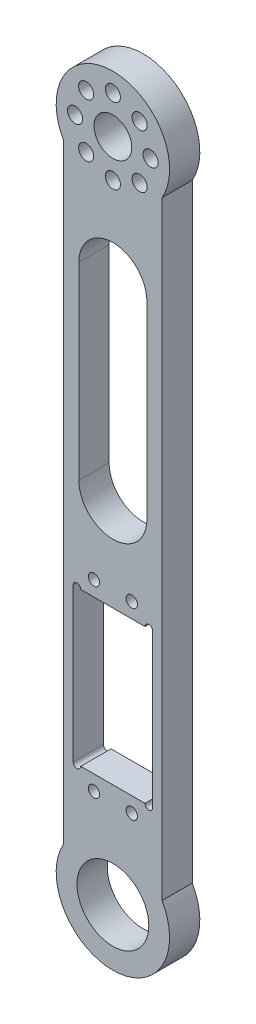
ISO-10303-21;
HEADER;
FILE_DESCRIPTION(('STEP AP214'),'2;1');
FILE_NAME('part.step','',(''),(''),'','','');
FILE_SCHEMA(('AUTOMOTIVE_DESIGN { 1 0 10303 214 1 1 1 1 }'));
ENDSEC;
DATA;
#1=APPLICATION_CONTEXT('core data for automotive mechanical design processes');
#2=APPLICATION_PROTOCOL_DEFINITION('international standard','automotive_design',2000,#1);
#3=PRODUCT_CONTEXT('',#1,'mechanical');
#4=PRODUCT('Part','Part','',(#3));
#5=PRODUCT_RELATED_PRODUCT_CATEGORY('part','',(#4));
#6=PRODUCT_DEFINITION_FORMATION('','',#4);
#7=PRODUCT_DEFINITION_CONTEXT('part definition',#1,'design');
#8=PRODUCT_DEFINITION('design','',#6,#7);
#9=PRODUCT_DEFINITION_SHAPE('','',#8);
#10=(LENGTH_UNIT() NAMED_UNIT(*) SI_UNIT(.MILLI.,.METRE.));
#11=(NAMED_UNIT(*) PLANE_ANGLE_UNIT() SI_UNIT($,.RADIAN.));
#12=(NAMED_UNIT(*) SI_UNIT($,.STERADIAN.) SOLID_ANGLE_UNIT());
#13=UNCERTAINTY_MEASURE_WITH_UNIT(LENGTH_MEASURE(1.E-05),#10,'distance_accuracy_value','');
#14=(GEOMETRIC_REPRESENTATION_CONTEXT(3) GLOBAL_UNCERTAINTY_ASSIGNED_CONTEXT((#13)) GLOBAL_UNIT_ASSIGNED_CONTEXT((#10,
#11,#12)) REPRESENTATION_CONTEXT('',''));
#15=CARTESIAN_POINT('',(0.,0.,0.));
#16=DIRECTION('',(0.,0.,1.));
#17=DIRECTION('',(1.,0.,0.));
#18=AXIS2_PLACEMENT_3D('',#15,#16,#17);
#19=CARTESIAN_POINT('',(0.,0.,8.));
#20=DIRECTION('',(0.,0.,1.));
#21=DIRECTION('',(1.,0.,0.));
#22=AXIS2_PLACEMENT_3D('',#19,#20,#21);
#23=PLANE('',#22);
#24=CARTESIAN_POINT('',(-9.5,-60.5,8.));
#25=DIRECTION('',(0.,0.,1.));
#26=DIRECTION('',(-1.,0.,0.));
#27=AXIS2_PLACEMENT_3D('',#24,#25,#26);
#28=CIRCLE('',#27,1.);
#29=CARTESIAN_POINT('',(-10.5,-60.5,8.));
#30=VERTEX_POINT('',#29);
#31=CARTESIAN_POINT('',(-8.5,-60.5,8.));
#32=VERTEX_POINT('',#31);
#33=EDGE_CURVE('E175',#30,#32,#28,.T.);
#34=ORIENTED_EDGE('',*,*,#33,.F.);
#35=DIRECTION('',(0.,-1.,0.));
#36=VECTOR('',#35,1.);
#37=CARTESIAN_POINT('',(-10.5,-20.,8.));
#38=LINE('',#37,#36);
#39=CARTESIAN_POINT('',(-10.5,-20.,8.));
#40=VERTEX_POINT('',#39);
#41=EDGE_CURVE('E220',#40,#30,#38,.T.);
#42=ORIENTED_EDGE('',*,*,#41,.F.);
#43=CARTESIAN_POINT('',(-9.50000000000001,-20.,8.));
#44=DIRECTION('',(0.,0.,1.));
#45=DIRECTION('',(1.,0.,0.));
#46=AXIS2_PLACEMENT_3D('',#43,#44,#45);
#47=CIRCLE('',#46,1.);
#48=CARTESIAN_POINT('',(-8.50000000000001,-20.,8.));
#49=VERTEX_POINT('',#48);
#50=EDGE_CURVE('E180',#49,#40,#47,.T.);
#51=ORIENTED_EDGE('',*,*,#50,.F.);
#52=DIRECTION('',(-1.,0.,0.));
#53=VECTOR('',#52,1.);
#54=CARTESIAN_POINT('',(-10.5,-20.,8.));
#55=LINE('',#54,#53);
#56=CARTESIAN_POINT('',(8.50000000000001,-20.,8.));
#57=VERTEX_POINT('',#56);
#58=EDGE_CURVE('E216',#57,#49,#55,.T.);
#59=ORIENTED_EDGE('',*,*,#58,.F.);
#60=CARTESIAN_POINT('',(9.50000000000001,-20.,8.));
#61=DIRECTION('',(0.,0.,1.));
#62=DIRECTION('',(-1.,0.,0.));
#63=AXIS2_PLACEMENT_3D('',#60,#61,#62);
#64=CIRCLE('',#63,1.);
#65=CARTESIAN_POINT('',(10.5,-20.,8.));
#66=VERTEX_POINT('',#65);
#67=EDGE_CURVE('E178',#66,#57,#64,.T.);
#68=ORIENTED_EDGE('',*,*,#67,.F.);
#69=DIRECTION('',(0.,1.,0.));
#70=VECTOR('',#69,1.);
#71=CARTESIAN_POINT('',(10.5,-20.,8.));
#72=LINE('',#71,#70);
#73=CARTESIAN_POINT('',(10.5,-60.5,8.));
#74=VERTEX_POINT('',#73);
#75=EDGE_CURVE('E213',#74,#66,#72,.T.);
#76=ORIENTED_EDGE('',*,*,#75,.F.);
#77=CARTESIAN_POINT('',(9.50000000000001,-60.5,8.));
#78=DIRECTION('',(0.,0.,1.));
#79=DIRECTION('',(1.,0.,0.));
#80=AXIS2_PLACEMENT_3D('',#77,#78,#79);
#81=CIRCLE('',#80,1.);
#82=CARTESIAN_POINT('',(8.50000000000001,-60.5,8.));
#83=VERTEX_POINT('',#82);
#84=EDGE_CURVE('E181',#83,#74,#81,.T.);
#85=ORIENTED_EDGE('',*,*,#84,.F.);
#86=DIRECTION('',(1.,0.,0.));
#87=VECTOR('',#86,1.);
#88=CARTESIAN_POINT('',(-10.5,-60.5,8.));
#89=LINE('',#88,#87);
#90=EDGE_CURVE('E223',#32,#83,#89,.T.);
#91=ORIENTED_EDGE('',*,*,#90,.F.);
#92=EDGE_LOOP('',(#34,#42,#51,#59,#68,#76,#85,#91));
#93=FACE_BOUND('',#92,.T.);
#94=CARTESIAN_POINT('',(5.00000000000031,-16.,8.));
#95=DIRECTION('',(0.,0.,1.));
#96=DIRECTION('',(1.,0.,0.));
#97=AXIS2_PLACEMENT_3D('',#94,#95,#96);
#98=CIRCLE('',#97,1.5);
#99=CARTESIAN_POINT('',(6.50000000000031,-16.,8.));
#100=VERTEX_POINT('',#99);
#101=EDGE_CURVE('E204',#100,#100,#98,.T.);
#102=ORIENTED_EDGE('',*,*,#101,.F.);
#103=EDGE_LOOP('',(#102));
#104=FACE_BOUND('',#103,.T.);
#105=CARTESIAN_POINT('',(-5.00000000000005,-64.5,8.));
#106=DIRECTION('',(0.,0.,1.));
#107=DIRECTION('',(1.,0.,0.));
#108=AXIS2_PLACEMENT_3D('',#105,#106,#107);
#109=CIRCLE('',#108,1.5);
#110=CARTESIAN_POINT('',(-3.50000000000005,-64.5,8.));
#111=VERTEX_POINT('',#110);
#112=EDGE_CURVE('E203',#111,#111,#109,.T.);
#113=ORIENTED_EDGE('',*,*,#112,.F.);
#114=EDGE_LOOP('',(#113));
#115=FACE_BOUND('',#114,.T.);
#116=CARTESIAN_POINT('',(4.99999999999997,-64.5,8.));
#117=DIRECTION('',(0.,0.,1.));
#118=DIRECTION('',(1.,0.,0.));
#119=AXIS2_PLACEMENT_3D('',#116,#117,#118);
#120=CIRCLE('',#119,1.5);
#121=CARTESIAN_POINT('',(6.49999999999997,-64.5,8.));
#122=VERTEX_POINT('',#121);
#123=EDGE_CURVE('E200',#122,#122,#120,.T.);
#124=ORIENTED_EDGE('',*,*,#123,.F.);
#125=EDGE_LOOP('',(#124));
#126=FACE_BOUND('',#125,.T.);
#127=CARTESIAN_POINT('',(-4.99999999999969,-16.,8.));
#128=DIRECTION('',(0.,0.,1.));
#129=DIRECTION('',(1.,0.,0.));
#130=AXIS2_PLACEMENT_3D('',#127,#128,#129);
#131=CIRCLE('',#130,1.5);
#132=CARTESIAN_POINT('',(-3.49999999999969,-16.,8.));
#133=VERTEX_POINT('',#132);
#134=EDGE_CURVE('E207',#133,#133,#131,.T.);
#135=ORIENTED_EDGE('',*,*,#134,.F.);
#136=EDGE_LOOP('',(#135));
#137=FACE_BOUND('',#136,.T.);
#138=CARTESIAN_POINT('',(-7.07106781186532,80.9289321881343,8.));
#139=DIRECTION('',(0.,0.,1.));
#140=DIRECTION('',(1.,0.,0.));
#141=AXIS2_PLACEMENT_3D('',#138,#139,#140);
#142=CIRCLE('',#141,2.);
#143=CARTESIAN_POINT('',(-5.07106781186532,80.9289321881343,8.));
#144=VERTEX_POINT('',#143);
#145=EDGE_CURVE('E240',#144,#144,#142,.T.);
#146=ORIENTED_EDGE('',*,*,#145,.F.);
#147=EDGE_LOOP('',(#146));
#148=FACE_BOUND('',#147,.T.);
#149=CARTESIAN_POINT('',(7.07106781186563,80.9289321881347,8.));
#150=DIRECTION('',(0.,0.,1.));
#151=DIRECTION('',(1.,0.,0.));
#152=AXIS2_PLACEMENT_3D('',#149,#150,#151);
#153=CIRCLE('',#152,2.00000000000005);
#154=CARTESIAN_POINT('',(9.07106781186569,80.9289321881347,8.));
#155=VERTEX_POINT('',#154);
#156=EDGE_CURVE('E259',#155,#155,#153,.T.);
#157=ORIENTED_EDGE('',*,*,#156,.F.);
#158=EDGE_LOOP('',(#157));
#159=FACE_BOUND('',#158,.T.);
#160=CARTESIAN_POINT('',(7.07106781186531,95.0710678118656,8.));
#161=DIRECTION('',(0.,0.,1.));
#162=DIRECTION('',(1.,0.,0.));
#163=AXIS2_PLACEMENT_3D('',#160,#161,#162);
#164=CIRCLE('',#163,1.99999999999999);
#165=CARTESIAN_POINT('',(9.0710678118653,95.0710678118656,8.));
#166=VERTEX_POINT('',#165);
#167=EDGE_CURVE('E253',#166,#166,#164,.T.);
#168=ORIENTED_EDGE('',*,*,#167,.F.);
#169=EDGE_LOOP('',(#168));
#170=FACE_BOUND('',#169,.T.);
#171=CARTESIAN_POINT('',(-10.,88.,8.));
#172=DIRECTION('',(0.,0.,1.));
#173=DIRECTION('',(1.,0.,0.));
#174=AXIS2_PLACEMENT_3D('',#171,#172,#173);
#175=CIRCLE('',#174,2.00000000000011);
#176=CARTESIAN_POINT('',(-7.99999999999989,88.,8.));
#177=VERTEX_POINT('',#176);
#178=EDGE_CURVE('E247',#177,#177,#175,.T.);
#179=ORIENTED_EDGE('',*,*,#178,.F.);
#180=EDGE_LOOP('',(#179));
#181=FACE_BOUND('',#180,.T.);
#182=CARTESIAN_POINT('',(0.,98.,8.));
#183=DIRECTION('',(0.,0.,1.));
#184=DIRECTION('',(1.,0.,0.));
#185=AXIS2_PLACEMENT_3D('',#182,#183,#184);
#186=CIRCLE('',#185,2.);
#187=CARTESIAN_POINT('',(2.,98.,8.));
#188=VERTEX_POINT('',#187);
#189=EDGE_CURVE('E283',#188,#188,#186,.T.);
#190=ORIENTED_EDGE('',*,*,#189,.F.);
#191=EDGE_LOOP('',(#190));
#192=FACE_BOUND('',#191,.T.);
#193=CARTESIAN_POINT('',(0.,-88.,8.));
#194=DIRECTION('',(0.,0.,1.));
#195=DIRECTION('',(1.,0.,0.));
#196=AXIS2_PLACEMENT_3D('',#193,#194,#195);
#197=CIRCLE('',#196,9.49999999999999);
#198=CARTESIAN_POINT('',(9.5,-88.,8.));
#199=VERTEX_POINT('',#198);
#200=EDGE_CURVE('E270',#199,#199,#197,.T.);
#201=ORIENTED_EDGE('',*,*,#200,.F.);
#202=EDGE_LOOP('',(#201));
#203=FACE_BOUND('',#202,.T.);
#204=CARTESIAN_POINT('',(9.99999999999999,88.,8.));
#205=DIRECTION('',(0.,0.,1.));
#206=DIRECTION('',(1.,0.,0.));
#207=AXIS2_PLACEMENT_3D('',#204,#205,#206);
#208=CIRCLE('',#207,1.99999999999987);
#209=CARTESIAN_POINT('',(11.9999999999999,88.,8.));
#210=VERTEX_POINT('',#209);
#211=EDGE_CURVE('E271',#210,#210,#208,.T.);
#212=ORIENTED_EDGE('',*,*,#211,.F.);
#213=EDGE_LOOP('',(#212));
#214=FACE_BOUND('',#213,.T.);
#215=CARTESIAN_POINT('',(0.,78.,8.));
#216=DIRECTION('',(0.,0.,1.));
#217=DIRECTION('',(1.,0.,0.));
#218=AXIS2_PLACEMENT_3D('',#215,#216,#217);
#219=CIRCLE('',#218,2.);
#220=CARTESIAN_POINT('',(2.,78.,8.));
#221=VERTEX_POINT('',#220);
#222=EDGE_CURVE('E246',#221,#221,#219,.T.);
#223=ORIENTED_EDGE('',*,*,#222,.F.);
#224=EDGE_LOOP('',(#223));
#225=FACE_BOUND('',#224,.T.);
#226=CARTESIAN_POINT('',(-7.07106781186564,95.0710678118653,8.));
#227=DIRECTION('',(0.,0.,1.));
#228=DIRECTION('',(1.,0.,0.));
#229=AXIS2_PLACEMENT_3D('',#226,#227,#228);
#230=CIRCLE('',#229,1.99999999999991);
#231=CARTESIAN_POINT('',(-5.07106781186573,95.0710678118653,8.));
#232=VERTEX_POINT('',#231);
#233=EDGE_CURVE('E230',#232,#232,#230,.T.);
#234=ORIENTED_EDGE('',*,*,#233,.F.);
#235=EDGE_LOOP('',(#234));
#236=FACE_BOUND('',#235,.T.);
#237=CARTESIAN_POINT('',(0.,88.,8.));
#238=DIRECTION('',(0.,0.,1.));
#239=DIRECTION('',(1.,0.,0.));
#240=AXIS2_PLACEMENT_3D('',#237,#238,#239);
#241=CIRCLE('',#240,5.00000000000001);
#242=CARTESIAN_POINT('',(5.,88.,8.));
#243=VERTEX_POINT('',#242);
#244=EDGE_CURVE('E282',#243,#243,#241,.T.);
#245=ORIENTED_EDGE('',*,*,#244,.F.);
#246=EDGE_LOOP('',(#245));
#247=FACE_BOUND('',#246,.T.);
#248=CARTESIAN_POINT('',(0.,88.,8.));
#249=DIRECTION('',(0.,0.,1.));
#250=DIRECTION('',(1.,0.,0.));
#251=AXIS2_PLACEMENT_3D('',#248,#249,#250);
#252=CIRCLE('',#251,15.);
#253=CARTESIAN_POINT('',(13.,80.5166852264521,8.));
#254=VERTEX_POINT('',#253);
#255=CARTESIAN_POINT('',(-13.,80.5166852264521,8.));
#256=VERTEX_POINT('',#255);
#257=EDGE_CURVE('E297',#254,#256,#252,.T.);
#258=ORIENTED_EDGE('',*,*,#257,.T.);
#259=DIRECTION('',(0.,-1.,0.));
#260=VECTOR('',#259,1.);
#261=CARTESIAN_POINT('',(-13.,0.,8.));
#262=LINE('',#261,#260);
#263=CARTESIAN_POINT('',(-13.,-80.5166852264521,8.));
#264=VERTEX_POINT('',#263);
#265=EDGE_CURVE('E300',#256,#264,#262,.T.);
#266=ORIENTED_EDGE('',*,*,#265,.T.);
#267=CARTESIAN_POINT('',(0.,-88.,8.));
#268=DIRECTION('',(0.,0.,1.));
#269=DIRECTION('',(1.,0.,0.));
#270=AXIS2_PLACEMENT_3D('',#267,#268,#269);
#271=CIRCLE('',#270,15.);
#272=CARTESIAN_POINT('',(13.,-80.5166852264521,8.));
#273=VERTEX_POINT('',#272);
#274=EDGE_CURVE('E303',#264,#273,#271,.T.);
#275=ORIENTED_EDGE('',*,*,#274,.T.);
#276=DIRECTION('',(0.,-1.,0.));
#277=VECTOR('',#276,1.);
#278=CARTESIAN_POINT('',(13.,0.,8.));
#279=LINE('',#278,#277);
#280=EDGE_CURVE('E305',#254,#273,#279,.T.);
#281=ORIENTED_EDGE('',*,*,#280,.F.);
#282=EDGE_LOOP('',(#258,#266,#275,#281));
#283=FACE_BOUND('',#282,.T.);
#284=DIRECTION('',(0.,-1.,0.));
#285=VECTOR('',#284,1.);
#286=CARTESIAN_POINT('',(-8.99999999999999,0.,8.));
#287=LINE('',#286,#285);
#288=CARTESIAN_POINT('',(-9.,54.75,8.));
#289=VERTEX_POINT('',#288);
#290=CARTESIAN_POINT('',(-8.99999999999999,4.75,8.));
#291=VERTEX_POINT('',#290);
#292=EDGE_CURVE('E163',#289,#291,#287,.T.);
#293=ORIENTED_EDGE('',*,*,#292,.F.);
#294=CARTESIAN_POINT('',(0.,54.75,8.));
#295=DIRECTION('',(0.,0.,1.));
#296=DIRECTION('',(1.,0.,0.));
#297=AXIS2_PLACEMENT_3D('',#294,#295,#296);
#298=CIRCLE('',#297,9.);
#299=CARTESIAN_POINT('',(9.,54.75,8.));
#300=VERTEX_POINT('',#299);
#301=EDGE_CURVE('E54',#289,#300,#298,.F.);
#302=ORIENTED_EDGE('',*,*,#301,.T.);
#303=DIRECTION('',(0.,-1.,0.));
#304=VECTOR('',#303,1.);
#305=CARTESIAN_POINT('',(9.00000000000001,0.,8.));
#306=LINE('',#305,#304);
#307=CARTESIAN_POINT('',(9.00000000000001,4.74999999999999,8.));
#308=VERTEX_POINT('',#307);
#309=EDGE_CURVE('E168',#300,#308,#306,.T.);
#310=ORIENTED_EDGE('',*,*,#309,.T.);
#311=CARTESIAN_POINT('',(0.,4.74999999999999,8.));
#312=DIRECTION('',(0.,0.,1.));
#313=DIRECTION('',(1.,0.,0.));
#314=AXIS2_PLACEMENT_3D('',#311,#312,#313);
#315=CIRCLE('',#314,9.);
#316=EDGE_CURVE('E154',#291,#308,#315,.T.);
#317=ORIENTED_EDGE('',*,*,#316,.F.);
#318=EDGE_LOOP('',(#293,#302,#310,#317));
#319=FACE_BOUND('',#318,.T.);
#320=ADVANCED_FACE('F39',(#93,#104,#115,#126,#137,#148,#159,#170,#181,#192,#203,#214,#225,#236,
#247,#283,#319),#23,.T.);
#321=CARTESIAN_POINT('',(0.,0.,0.));
#322=DIRECTION('',(0.,0.,1.));
#323=DIRECTION('',(1.,0.,0.));
#324=AXIS2_PLACEMENT_3D('',#321,#322,#323);
#325=PLANE('',#324);
#326=CARTESIAN_POINT('',(0.,88.,0.));
#327=DIRECTION('',(0.,0.,1.));
#328=DIRECTION('',(1.,0.,0.));
#329=AXIS2_PLACEMENT_3D('',#326,#327,#328);
#330=CIRCLE('',#329,15.);
#331=CARTESIAN_POINT('',(13.,80.5166852264521,0.));
#332=VERTEX_POINT('',#331);
#333=CARTESIAN_POINT('',(-13.,80.5166852264521,0.));
#334=VERTEX_POINT('',#333);
#335=EDGE_CURVE('E294',#332,#334,#330,.T.);
#336=ORIENTED_EDGE('',*,*,#335,.F.);
#337=DIRECTION('',(0.,-1.,0.));
#338=VECTOR('',#337,1.);
#339=CARTESIAN_POINT('',(13.,0.,0.));
#340=LINE('',#339,#338);
#341=CARTESIAN_POINT('',(13.,-80.5166852264521,0.));
#342=VERTEX_POINT('',#341);
#343=EDGE_CURVE('E301',#332,#342,#340,.T.);
#344=ORIENTED_EDGE('',*,*,#343,.T.);
#345=CARTESIAN_POINT('',(0.,-88.,0.));
#346=DIRECTION('',(0.,0.,1.));
#347=DIRECTION('',(1.,0.,0.));
#348=AXIS2_PLACEMENT_3D('',#345,#346,#347);
#349=CIRCLE('',#348,15.);
#350=CARTESIAN_POINT('',(-13.,-80.5166852264521,0.));
#351=VERTEX_POINT('',#350);
#352=EDGE_CURVE('E313',#351,#342,#349,.T.);
#353=ORIENTED_EDGE('',*,*,#352,.F.);
#354=DIRECTION('',(0.,-1.,0.));
#355=VECTOR('',#354,1.);
#356=CARTESIAN_POINT('',(-13.,0.,0.));
#357=LINE('',#356,#355);
#358=EDGE_CURVE('E311',#334,#351,#357,.T.);
#359=ORIENTED_EDGE('',*,*,#358,.F.);
#360=EDGE_LOOP('',(#336,#344,#353,#359));
#361=FACE_BOUND('',#360,.T.);
#362=CARTESIAN_POINT('',(0.,88.,0.));
#363=DIRECTION('',(0.,0.,1.));
#364=DIRECTION('',(1.,0.,0.));
#365=AXIS2_PLACEMENT_3D('',#362,#363,#364);
#366=CIRCLE('',#365,5.00000000000001);
#367=CARTESIAN_POINT('',(5.,88.,0.));
#368=VERTEX_POINT('',#367);
#369=EDGE_CURVE('E291',#368,#368,#366,.T.);
#370=ORIENTED_EDGE('',*,*,#369,.T.);
#371=EDGE_LOOP('',(#370));
#372=FACE_BOUND('',#371,.T.);
#373=CARTESIAN_POINT('',(-7.07106781186564,95.0710678118653,0.));
#374=DIRECTION('',(0.,0.,1.));
#375=DIRECTION('',(1.,0.,0.));
#376=AXIS2_PLACEMENT_3D('',#373,#374,#375);
#377=CIRCLE('',#376,1.99999999999991);
#378=CARTESIAN_POINT('',(-5.07106781186573,95.0710678118653,0.));
#379=VERTEX_POINT('',#378);
#380=EDGE_CURVE('E237',#379,#379,#377,.T.);
#381=ORIENTED_EDGE('',*,*,#380,.T.);
#382=EDGE_LOOP('',(#381));
#383=FACE_BOUND('',#382,.T.);
#384=CARTESIAN_POINT('',(0.,78.,0.));
#385=DIRECTION('',(0.,0.,1.));
#386=DIRECTION('',(1.,0.,0.));
#387=AXIS2_PLACEMENT_3D('',#384,#385,#386);
#388=CIRCLE('',#387,2.);
#389=CARTESIAN_POINT('',(2.,78.,0.));
#390=VERTEX_POINT('',#389);
#391=EDGE_CURVE('E274',#390,#390,#388,.T.);
#392=ORIENTED_EDGE('',*,*,#391,.T.);
#393=EDGE_LOOP('',(#392));
#394=FACE_BOUND('',#393,.T.);
#395=CARTESIAN_POINT('',(9.99999999999999,88.,0.));
#396=DIRECTION('',(0.,0.,1.));
#397=DIRECTION('',(1.,0.,0.));
#398=AXIS2_PLACEMENT_3D('',#395,#396,#397);
#399=CIRCLE('',#398,1.99999999999987);
#400=CARTESIAN_POINT('',(11.9999999999999,88.,0.));
#401=VERTEX_POINT('',#400);
#402=EDGE_CURVE('E267',#401,#401,#399,.T.);
#403=ORIENTED_EDGE('',*,*,#402,.T.);
#404=EDGE_LOOP('',(#403));
#405=FACE_BOUND('',#404,.T.);
#406=CARTESIAN_POINT('',(0.,-88.,0.));
#407=DIRECTION('',(0.,0.,1.));
#408=DIRECTION('',(1.,0.,0.));
#409=AXIS2_PLACEMENT_3D('',#406,#407,#408);
#410=CIRCLE('',#409,9.49999999999999);
#411=CARTESIAN_POINT('',(9.5,-88.,0.));
#412=VERTEX_POINT('',#411);
#413=EDGE_CURVE('E286',#412,#412,#410,.T.);
#414=ORIENTED_EDGE('',*,*,#413,.T.);
#415=EDGE_LOOP('',(#414));
#416=FACE_BOUND('',#415,.T.);
#417=CARTESIAN_POINT('',(0.,98.,0.));
#418=DIRECTION('',(0.,0.,1.));
#419=DIRECTION('',(1.,0.,0.));
#420=AXIS2_PLACEMENT_3D('',#417,#418,#419);
#421=CIRCLE('',#420,2.);
#422=CARTESIAN_POINT('',(2.,98.,0.));
#423=VERTEX_POINT('',#422);
#424=EDGE_CURVE('E279',#423,#423,#421,.T.);
#425=ORIENTED_EDGE('',*,*,#424,.T.);
#426=EDGE_LOOP('',(#425));
#427=FACE_BOUND('',#426,.T.);
#428=CARTESIAN_POINT('',(-10.,88.,0.));
#429=DIRECTION('',(0.,0.,1.));
#430=DIRECTION('',(1.,0.,0.));
#431=AXIS2_PLACEMENT_3D('',#428,#429,#430);
#432=CIRCLE('',#431,2.00000000000011);
#433=CARTESIAN_POINT('',(-7.99999999999989,88.,0.));
#434=VERTEX_POINT('',#433);
#435=EDGE_CURVE('E243',#434,#434,#432,.T.);
#436=ORIENTED_EDGE('',*,*,#435,.T.);
#437=EDGE_LOOP('',(#436));
#438=FACE_BOUND('',#437,.T.);
#439=CARTESIAN_POINT('',(7.07106781186531,95.0710678118656,0.));
#440=DIRECTION('',(0.,0.,1.));
#441=DIRECTION('',(1.,0.,0.));
#442=AXIS2_PLACEMENT_3D('',#439,#440,#441);
#443=CIRCLE('',#442,1.99999999999999);
#444=CARTESIAN_POINT('',(9.0710678118653,95.0710678118656,0.));
#445=VERTEX_POINT('',#444);
#446=EDGE_CURVE('E250',#445,#445,#443,.T.);
#447=ORIENTED_EDGE('',*,*,#446,.T.);
#448=EDGE_LOOP('',(#447));
#449=FACE_BOUND('',#448,.T.);
#450=CARTESIAN_POINT('',(7.07106781186563,80.9289321881347,0.));
#451=DIRECTION('',(0.,0.,1.));
#452=DIRECTION('',(1.,0.,0.));
#453=AXIS2_PLACEMENT_3D('',#450,#451,#452);
#454=CIRCLE('',#453,2.00000000000005);
#455=CARTESIAN_POINT('',(9.07106781186569,80.9289321881347,0.));
#456=VERTEX_POINT('',#455);
#457=EDGE_CURVE('E256',#456,#456,#454,.T.);
#458=ORIENTED_EDGE('',*,*,#457,.T.);
#459=EDGE_LOOP('',(#458));
#460=FACE_BOUND('',#459,.T.);
#461=CARTESIAN_POINT('',(-7.07106781186532,80.9289321881343,0.));
#462=DIRECTION('',(0.,0.,1.));
#463=DIRECTION('',(1.,0.,0.));
#464=AXIS2_PLACEMENT_3D('',#461,#462,#463);
#465=CIRCLE('',#464,2.);
#466=CARTESIAN_POINT('',(-5.07106781186532,80.9289321881343,0.));
#467=VERTEX_POINT('',#466);
#468=EDGE_CURVE('E262',#467,#467,#465,.T.);
#469=ORIENTED_EDGE('',*,*,#468,.T.);
#470=EDGE_LOOP('',(#469));
#471=FACE_BOUND('',#470,.T.);
#472=DIRECTION('',(0.,-1.,0.));
#473=VECTOR('',#472,1.);
#474=CARTESIAN_POINT('',(-10.5,0.,0.));
#475=LINE('',#474,#473);
#476=CARTESIAN_POINT('',(-10.5,-20.,0.));
#477=VERTEX_POINT('',#476);
#478=CARTESIAN_POINT('',(-10.5,-60.5,0.));
#479=VERTEX_POINT('',#478);
#480=EDGE_CURVE('E330',#477,#479,#475,.T.);
#481=ORIENTED_EDGE('',*,*,#480,.T.);
#482=CARTESIAN_POINT('',(-9.5,-60.5,0.));
#483=DIRECTION('',(0.,0.,1.));
#484=DIRECTION('',(1.,0.,0.));
#485=AXIS2_PLACEMENT_3D('',#482,#483,#484);
#486=CIRCLE('',#485,1.);
#487=CARTESIAN_POINT('',(-8.5,-60.5,0.));
#488=VERTEX_POINT('',#487);
#489=EDGE_CURVE('E191',#479,#488,#486,.T.);
#490=ORIENTED_EDGE('',*,*,#489,.T.);
#491=DIRECTION('',(1.,0.,0.));
#492=VECTOR('',#491,1.);
#493=CARTESIAN_POINT('',(0.,-60.5,0.));
#494=LINE('',#493,#492);
#495=CARTESIAN_POINT('',(8.50000000000001,-60.5,0.));
#496=VERTEX_POINT('',#495);
#497=EDGE_CURVE('E333',#488,#496,#494,.T.);
#498=ORIENTED_EDGE('',*,*,#497,.T.);
#499=CARTESIAN_POINT('',(9.50000000000001,-60.5,0.));
#500=DIRECTION('',(0.,0.,1.));
#501=DIRECTION('',(1.,0.,0.));
#502=AXIS2_PLACEMENT_3D('',#499,#500,#501);
#503=CIRCLE('',#502,1.);
#504=CARTESIAN_POINT('',(10.5,-60.5,0.));
#505=VERTEX_POINT('',#504);
#506=EDGE_CURVE('E197',#496,#505,#503,.T.);
#507=ORIENTED_EDGE('',*,*,#506,.T.);
#508=DIRECTION('',(0.,1.,0.));
#509=VECTOR('',#508,1.);
#510=CARTESIAN_POINT('',(10.5,0.,0.));
#511=LINE('',#510,#509);
#512=CARTESIAN_POINT('',(10.5,-20.,0.));
#513=VERTEX_POINT('',#512);
#514=EDGE_CURVE('E336',#505,#513,#511,.T.);
#515=ORIENTED_EDGE('',*,*,#514,.T.);
#516=CARTESIAN_POINT('',(9.50000000000001,-20.,0.));
#517=DIRECTION('',(0.,0.,1.));
#518=DIRECTION('',(1.,0.,0.));
#519=AXIS2_PLACEMENT_3D('',#516,#517,#518);
#520=CIRCLE('',#519,1.);
#521=CARTESIAN_POINT('',(8.50000000000001,-20.,0.));
#522=VERTEX_POINT('',#521);
#523=EDGE_CURVE('E188',#513,#522,#520,.T.);
#524=ORIENTED_EDGE('',*,*,#523,.T.);
#525=DIRECTION('',(-1.,0.,0.));
#526=VECTOR('',#525,1.);
#527=CARTESIAN_POINT('',(0.,-20.,0.));
#528=LINE('',#527,#526);
#529=CARTESIAN_POINT('',(-8.50000000000001,-20.,0.));
#530=VERTEX_POINT('',#529);
#531=EDGE_CURVE('E327',#522,#530,#528,.T.);
#532=ORIENTED_EDGE('',*,*,#531,.T.);
#533=CARTESIAN_POINT('',(-9.50000000000001,-20.,0.));
#534=DIRECTION('',(0.,0.,1.));
#535=DIRECTION('',(1.,0.,0.));
#536=AXIS2_PLACEMENT_3D('',#533,#534,#535);
#537=CIRCLE('',#536,1.);
#538=EDGE_CURVE('E185',#530,#477,#537,.T.);
#539=ORIENTED_EDGE('',*,*,#538,.T.);
#540=EDGE_LOOP('',(#481,#490,#498,#507,#515,#524,#532,#539));
#541=FACE_BOUND('',#540,.T.);
#542=CARTESIAN_POINT('',(-4.99999999999969,-16.,0.));
#543=DIRECTION('',(0.,0.,1.));
#544=DIRECTION('',(1.,0.,0.));
#545=AXIS2_PLACEMENT_3D('',#542,#543,#544);
#546=CIRCLE('',#545,1.5);
#547=CARTESIAN_POINT('',(-3.49999999999969,-16.,0.));
#548=VERTEX_POINT('',#547);
#549=EDGE_CURVE('E212',#548,#548,#546,.T.);
#550=ORIENTED_EDGE('',*,*,#549,.T.);
#551=EDGE_LOOP('',(#550));
#552=FACE_BOUND('',#551,.T.);
#553=CARTESIAN_POINT('',(4.99999999999997,-64.5,0.));
#554=DIRECTION('',(0.,0.,1.));
#555=DIRECTION('',(1.,0.,0.));
#556=AXIS2_PLACEMENT_3D('',#553,#554,#555);
#557=CIRCLE('',#556,1.5);
#558=CARTESIAN_POINT('',(6.49999999999997,-64.5,0.));
#559=VERTEX_POINT('',#558);
#560=EDGE_CURVE('E342',#559,#559,#557,.T.);
#561=ORIENTED_EDGE('',*,*,#560,.T.);
#562=EDGE_LOOP('',(#561));
#563=FACE_BOUND('',#562,.T.);
#564=CARTESIAN_POINT('',(-5.00000000000005,-64.5,0.));
#565=DIRECTION('',(0.,0.,1.));
#566=DIRECTION('',(1.,0.,0.));
#567=AXIS2_PLACEMENT_3D('',#564,#565,#566);
#568=CIRCLE('',#567,1.5);
#569=CARTESIAN_POINT('',(-3.50000000000005,-64.5,0.));
#570=VERTEX_POINT('',#569);
#571=EDGE_CURVE('E345',#570,#570,#568,.T.);
#572=ORIENTED_EDGE('',*,*,#571,.T.);
#573=EDGE_LOOP('',(#572));
#574=FACE_BOUND('',#573,.T.);
#575=CARTESIAN_POINT('',(5.00000000000031,-16.,0.));
#576=DIRECTION('',(0.,0.,1.));
#577=DIRECTION('',(1.,0.,0.));
#578=AXIS2_PLACEMENT_3D('',#575,#576,#577);
#579=CIRCLE('',#578,1.5);
#580=CARTESIAN_POINT('',(6.50000000000031,-16.,0.));
#581=VERTEX_POINT('',#580);
#582=EDGE_CURVE('E217',#581,#581,#579,.T.);
#583=ORIENTED_EDGE('',*,*,#582,.T.);
#584=EDGE_LOOP('',(#583));
#585=FACE_BOUND('',#584,.T.);
#586=CARTESIAN_POINT('',(0.,54.75,0.));
#587=DIRECTION('',(0.,0.,1.));
#588=DIRECTION('',(1.,0.,0.));
#589=AXIS2_PLACEMENT_3D('',#586,#587,#588);
#590=CIRCLE('',#589,9.);
#591=CARTESIAN_POINT('',(-9.,54.75,0.));
#592=VERTEX_POINT('',#591);
#593=CARTESIAN_POINT('',(9.,54.75,0.));
#594=VERTEX_POINT('',#593);
#595=EDGE_CURVE('E11',#592,#594,#590,.F.);
#596=ORIENTED_EDGE('',*,*,#595,.F.);
#597=DIRECTION('',(0.,-1.,0.));
#598=VECTOR('',#597,1.);
#599=CARTESIAN_POINT('',(-8.99999999999999,0.,0.));
#600=LINE('',#599,#598);
#601=CARTESIAN_POINT('',(-8.99999999999999,4.75,0.));
#602=VERTEX_POINT('',#601);
#603=EDGE_CURVE('E358',#592,#602,#600,.T.);
#604=ORIENTED_EDGE('',*,*,#603,.T.);
#605=CARTESIAN_POINT('',(0.,4.74999999999999,0.));
#606=DIRECTION('',(0.,0.,1.));
#607=DIRECTION('',(1.,0.,0.));
#608=AXIS2_PLACEMENT_3D('',#605,#606,#607);
#609=CIRCLE('',#608,9.);
#610=CARTESIAN_POINT('',(9.00000000000001,4.74999999999999,0.));
#611=VERTEX_POINT('',#610);
#612=EDGE_CURVE('E157',#602,#611,#609,.T.);
#613=ORIENTED_EDGE('',*,*,#612,.T.);
#614=DIRECTION('',(0.,-1.,0.));
#615=VECTOR('',#614,1.);
#616=CARTESIAN_POINT('',(9.00000000000001,0.,0.));
#617=LINE('',#616,#615);
#618=EDGE_CURVE('E47',#594,#611,#617,.T.);
#619=ORIENTED_EDGE('',*,*,#618,.F.);
#620=EDGE_LOOP('',(#596,#604,#613,#619));
#621=FACE_BOUND('',#620,.T.);
#622=ADVANCED_FACE('F366',(#361,#372,#383,#394,#405,#416,#427,#438,#449,#460,#471,#541,#552,
#563,#574,#585,#621),#325,.F.);
#623=CARTESIAN_POINT('',(0.,88.,8.));
#624=DIRECTION('',(0.,0.,-1.));
#625=DIRECTION('',(-1.,0.,0.));
#626=AXIS2_PLACEMENT_3D('',#623,#624,#625);
#627=CYLINDRICAL_SURFACE('',#626,15.);
#628=ORIENTED_EDGE('',*,*,#335,.T.);
#629=DIRECTION('',(0.,0.,-1.));
#630=VECTOR('',#629,1.);
#631=CARTESIAN_POINT('',(-13.,80.5166852264521,8.));
#632=LINE('',#631,#630);
#633=EDGE_CURVE('E324',#256,#334,#632,.T.);
#634=ORIENTED_EDGE('',*,*,#633,.F.);
#635=ORIENTED_EDGE('',*,*,#257,.F.);
#636=DIRECTION('',(0.,0.,-1.));
#637=VECTOR('',#636,1.);
#638=CARTESIAN_POINT('',(13.,80.5166852264521,8.));
#639=LINE('',#638,#637);
#640=EDGE_CURVE('E308',#254,#332,#639,.T.);
#641=ORIENTED_EDGE('',*,*,#640,.T.);
#642=EDGE_LOOP('',(#628,#634,#635,#641));
#643=FACE_BOUND('',#642,.T.);
#644=ADVANCED_FACE('F41',(#643),#627,.T.);
#645=CARTESIAN_POINT('',(-13.,0.,8.));
#646=DIRECTION('',(1.,0.,0.));
#647=DIRECTION('',(0.,1.,0.));
#648=AXIS2_PLACEMENT_3D('',#645,#646,#647);
#649=PLANE('',#648);
#650=ORIENTED_EDGE('',*,*,#358,.T.);
#651=DIRECTION('',(0.,0.,-1.));
#652=VECTOR('',#651,1.);
#653=CARTESIAN_POINT('',(-13.,-80.5166852264521,8.));
#654=LINE('',#653,#652);
#655=EDGE_CURVE('E321',#264,#351,#654,.T.);
#656=ORIENTED_EDGE('',*,*,#655,.F.);
#657=ORIENTED_EDGE('',*,*,#265,.F.);
#658=ORIENTED_EDGE('',*,*,#633,.T.);
#659=EDGE_LOOP('',(#650,#656,#657,#658));
#660=FACE_BOUND('',#659,.T.);
#661=ADVANCED_FACE('F401',(#660),#649,.F.);
#662=CARTESIAN_POINT('',(0.,-88.,8.));
#663=DIRECTION('',(0.,0.,-1.));
#664=DIRECTION('',(-1.,0.,0.));
#665=AXIS2_PLACEMENT_3D('',#662,#663,#664);
#666=CYLINDRICAL_SURFACE('',#665,15.);
#667=ORIENTED_EDGE('',*,*,#352,.T.);
#668=DIRECTION('',(0.,0.,-1.));
#669=VECTOR('',#668,1.);
#670=CARTESIAN_POINT('',(13.,-80.5166852264521,8.));
#671=LINE('',#670,#669);
#672=EDGE_CURVE('E319',#273,#342,#671,.T.);
#673=ORIENTED_EDGE('',*,*,#672,.F.);
#674=ORIENTED_EDGE('',*,*,#274,.F.);
#675=ORIENTED_EDGE('',*,*,#655,.T.);
#676=EDGE_LOOP('',(#667,#673,#674,#675));
#677=FACE_BOUND('',#676,.T.);
#678=ADVANCED_FACE('F398',(#677),#666,.T.);
#679=CARTESIAN_POINT('',(13.,0.,8.));
#680=DIRECTION('',(1.,0.,0.));
#681=DIRECTION('',(0.,1.,0.));
#682=AXIS2_PLACEMENT_3D('',#679,#680,#681);
#683=PLANE('',#682);
#684=ORIENTED_EDGE('',*,*,#343,.F.);
#685=ORIENTED_EDGE('',*,*,#640,.F.);
#686=ORIENTED_EDGE('',*,*,#280,.T.);
#687=ORIENTED_EDGE('',*,*,#672,.T.);
#688=EDGE_LOOP('',(#684,#685,#686,#687));
#689=FACE_BOUND('',#688,.T.);
#690=ADVANCED_FACE('F395',(#689),#683,.T.);
#691=CARTESIAN_POINT('',(0.,88.,0.));
#692=DIRECTION('',(0.,0.,1.));
#693=DIRECTION('',(1.,0.,0.));
#694=AXIS2_PLACEMENT_3D('',#691,#692,#693);
#695=CYLINDRICAL_SURFACE('',#694,5.00000000000001);
#696=ORIENTED_EDGE('',*,*,#369,.F.);
#697=EDGE_LOOP('',(#696));
#698=FACE_BOUND('',#697,.T.);
#699=ORIENTED_EDGE('',*,*,#244,.T.);
#700=EDGE_LOOP('',(#699));
#701=FACE_BOUND('',#700,.T.);
#702=ADVANCED_FACE('F392',(#698,#701),#695,.F.);
#703=CARTESIAN_POINT('',(-7.07106781186564,95.0710678118653,0.));
#704=DIRECTION('',(0.,0.,1.));
#705=DIRECTION('',(1.,0.,0.));
#706=AXIS2_PLACEMENT_3D('',#703,#704,#705);
#707=CYLINDRICAL_SURFACE('',#706,1.99999999999991);
#708=ORIENTED_EDGE('',*,*,#380,.F.);
#709=EDGE_LOOP('',(#708));
#710=FACE_BOUND('',#709,.T.);
#711=ORIENTED_EDGE('',*,*,#233,.T.);
#712=EDGE_LOOP('',(#711));
#713=FACE_BOUND('',#712,.T.);
#714=ADVANCED_FACE('F489',(#710,#713),#707,.F.);
#715=CARTESIAN_POINT('',(0.,78.,0.));
#716=DIRECTION('',(0.,0.,1.));
#717=DIRECTION('',(1.,0.,0.));
#718=AXIS2_PLACEMENT_3D('',#715,#716,#717);
#719=CYLINDRICAL_SURFACE('',#718,2.);
#720=ORIENTED_EDGE('',*,*,#391,.F.);
#721=EDGE_LOOP('',(#720));
#722=FACE_BOUND('',#721,.T.);
#723=ORIENTED_EDGE('',*,*,#222,.T.);
#724=EDGE_LOOP('',(#723));
#725=FACE_BOUND('',#724,.T.);
#726=ADVANCED_FACE('F492',(#722,#725),#719,.F.);
#727=CARTESIAN_POINT('',(9.99999999999999,88.,0.));
#728=DIRECTION('',(0.,0.,1.));
#729=DIRECTION('',(1.,0.,0.));
#730=AXIS2_PLACEMENT_3D('',#727,#728,#729);
#731=CYLINDRICAL_SURFACE('',#730,1.99999999999987);
#732=ORIENTED_EDGE('',*,*,#402,.F.);
#733=EDGE_LOOP('',(#732));
#734=FACE_BOUND('',#733,.T.);
#735=ORIENTED_EDGE('',*,*,#211,.T.);
#736=EDGE_LOOP('',(#735));
#737=FACE_BOUND('',#736,.T.);
#738=ADVANCED_FACE('F510',(#734,#737),#731,.F.);
#739=CARTESIAN_POINT('',(0.,-88.,0.));
#740=DIRECTION('',(0.,0.,1.));
#741=DIRECTION('',(1.,0.,0.));
#742=AXIS2_PLACEMENT_3D('',#739,#740,#741);
#743=CYLINDRICAL_SURFACE('',#742,9.49999999999999);
#744=ORIENTED_EDGE('',*,*,#413,.F.);
#745=EDGE_LOOP('',(#744));
#746=FACE_BOUND('',#745,.T.);
#747=ORIENTED_EDGE('',*,*,#200,.T.);
#748=EDGE_LOOP('',(#747));
#749=FACE_BOUND('',#748,.T.);
#750=ADVANCED_FACE('F513',(#746,#749),#743,.F.);
#751=CARTESIAN_POINT('',(0.,98.,0.));
#752=DIRECTION('',(0.,0.,1.));
#753=DIRECTION('',(1.,0.,0.));
#754=AXIS2_PLACEMENT_3D('',#751,#752,#753);
#755=CYLINDRICAL_SURFACE('',#754,2.);
#756=ORIENTED_EDGE('',*,*,#424,.F.);
#757=EDGE_LOOP('',(#756));
#758=FACE_BOUND('',#757,.T.);
#759=ORIENTED_EDGE('',*,*,#189,.T.);
#760=EDGE_LOOP('',(#759));
#761=FACE_BOUND('',#760,.T.);
#762=ADVANCED_FACE('F498',(#758,#761),#755,.F.);
#763=CARTESIAN_POINT('',(-10.,88.,0.));
#764=DIRECTION('',(0.,0.,1.));
#765=DIRECTION('',(1.,0.,0.));
#766=AXIS2_PLACEMENT_3D('',#763,#764,#765);
#767=CYLINDRICAL_SURFACE('',#766,2.00000000000011);
#768=ORIENTED_EDGE('',*,*,#435,.F.);
#769=EDGE_LOOP('',(#768));
#770=FACE_BOUND('',#769,.T.);
#771=ORIENTED_EDGE('',*,*,#178,.T.);
#772=EDGE_LOOP('',(#771));
#773=FACE_BOUND('',#772,.T.);
#774=ADVANCED_FACE('F494',(#770,#773),#767,.F.);
#775=CARTESIAN_POINT('',(7.07106781186531,95.0710678118656,0.));
#776=DIRECTION('',(0.,0.,1.));
#777=DIRECTION('',(1.,0.,0.));
#778=AXIS2_PLACEMENT_3D('',#775,#776,#777);
#779=CYLINDRICAL_SURFACE('',#778,1.99999999999999);
#780=ORIENTED_EDGE('',*,*,#446,.F.);
#781=EDGE_LOOP('',(#780));
#782=FACE_BOUND('',#781,.T.);
#783=ORIENTED_EDGE('',*,*,#167,.T.);
#784=EDGE_LOOP('',(#783));
#785=FACE_BOUND('',#784,.T.);
#786=ADVANCED_FACE('F497',(#782,#785),#779,.F.);
#787=CARTESIAN_POINT('',(7.07106781186563,80.9289321881347,0.));
#788=DIRECTION('',(0.,0.,1.));
#789=DIRECTION('',(1.,0.,0.));
#790=AXIS2_PLACEMENT_3D('',#787,#788,#789);
#791=CYLINDRICAL_SURFACE('',#790,2.00000000000005);
#792=ORIENTED_EDGE('',*,*,#457,.F.);
#793=EDGE_LOOP('',(#792));
#794=FACE_BOUND('',#793,.T.);
#795=ORIENTED_EDGE('',*,*,#156,.T.);
#796=EDGE_LOOP('',(#795));
#797=FACE_BOUND('',#796,.T.);
#798=ADVANCED_FACE('F502',(#794,#797),#791,.F.);
#799=CARTESIAN_POINT('',(-7.07106781186532,80.9289321881343,0.));
#800=DIRECTION('',(0.,0.,1.));
#801=DIRECTION('',(1.,0.,0.));
#802=AXIS2_PLACEMENT_3D('',#799,#800,#801);
#803=CYLINDRICAL_SURFACE('',#802,2.);
#804=ORIENTED_EDGE('',*,*,#468,.F.);
#805=EDGE_LOOP('',(#804));
#806=FACE_BOUND('',#805,.T.);
#807=ORIENTED_EDGE('',*,*,#145,.T.);
#808=EDGE_LOOP('',(#807));
#809=FACE_BOUND('',#808,.T.);
#810=ADVANCED_FACE('F487',(#806,#809),#803,.F.);
#811=CARTESIAN_POINT('',(10.5,-20.,-2.));
#812=DIRECTION('',(1.,0.,0.));
#813=DIRECTION('',(0.,1.,0.));
#814=AXIS2_PLACEMENT_3D('',#811,#812,#813);
#815=PLANE('',#814);
#816=DIRECTION('',(0.,0.,1.));
#817=VECTOR('',#816,1.);
#818=CARTESIAN_POINT('',(10.5,-60.5,-2.));
#819=LINE('',#818,#817);
#820=EDGE_CURVE('E227',#505,#74,#819,.T.);
#821=ORIENTED_EDGE('',*,*,#820,.T.);
#822=ORIENTED_EDGE('',*,*,#75,.T.);
#823=DIRECTION('',(0.,0.,1.));
#824=VECTOR('',#823,1.);
#825=CARTESIAN_POINT('',(10.5,-20.,-2.));
#826=LINE('',#825,#824);
#827=EDGE_CURVE('E226',#513,#66,#826,.T.);
#828=ORIENTED_EDGE('',*,*,#827,.F.);
#829=ORIENTED_EDGE('',*,*,#514,.F.);
#830=EDGE_LOOP('',(#821,#822,#828,#829));
#831=FACE_BOUND('',#830,.T.);
#832=ADVANCED_FACE('F477',(#831),#815,.F.);
#833=CARTESIAN_POINT('',(-10.5,-60.5,-2.));
#834=DIRECTION('',(0.,-1.,0.));
#835=DIRECTION('',(0.,0.,-1.));
#836=AXIS2_PLACEMENT_3D('',#833,#834,#835);
#837=PLANE('',#836);
#838=ORIENTED_EDGE('',*,*,#497,.F.);
#839=DIRECTION('',(0.,0.,1.));
#840=VECTOR('',#839,1.);
#841=CARTESIAN_POINT('',(-8.5,-60.5,-2.));
#842=LINE('',#841,#840);
#843=EDGE_CURVE('E194',#488,#32,#842,.T.);
#844=ORIENTED_EDGE('',*,*,#843,.T.);
#845=ORIENTED_EDGE('',*,*,#90,.T.);
#846=DIRECTION('',(0.,0.,1.));
#847=VECTOR('',#846,1.);
#848=CARTESIAN_POINT('',(8.50000000000001,-60.5,-2.));
#849=LINE('',#848,#847);
#850=EDGE_CURVE('E355',#83,#496,#849,.F.);
#851=ORIENTED_EDGE('',*,*,#850,.T.);
#852=EDGE_LOOP('',(#838,#844,#845,#851));
#853=FACE_BOUND('',#852,.T.);
#854=ADVANCED_FACE('F473',(#853),#837,.F.);
#855=CARTESIAN_POINT('',(-10.5,-20.,-2.));
#856=DIRECTION('',(-1.,0.,0.));
#857=DIRECTION('',(0.,-1.,0.));
#858=AXIS2_PLACEMENT_3D('',#855,#856,#857);
#859=PLANE('',#858);
#860=DIRECTION('',(0.,0.,1.));
#861=VECTOR('',#860,1.);
#862=CARTESIAN_POINT('',(-10.5,-20.,-2.));
#863=LINE('',#862,#861);
#864=EDGE_CURVE('E233',#477,#40,#863,.T.);
#865=ORIENTED_EDGE('',*,*,#864,.T.);
#866=ORIENTED_EDGE('',*,*,#41,.T.);
#867=DIRECTION('',(0.,0.,1.));
#868=VECTOR('',#867,1.);
#869=CARTESIAN_POINT('',(-10.5,-60.5,-2.));
#870=LINE('',#869,#868);
#871=EDGE_CURVE('E231',#479,#30,#870,.T.);
#872=ORIENTED_EDGE('',*,*,#871,.F.);
#873=ORIENTED_EDGE('',*,*,#480,.F.);
#874=EDGE_LOOP('',(#865,#866,#872,#873));
#875=FACE_BOUND('',#874,.T.);
#876=ADVANCED_FACE('F476',(#875),#859,.F.);
#877=CARTESIAN_POINT('',(-10.5,-20.,-2.));
#878=DIRECTION('',(0.,1.,0.));
#879=DIRECTION('',(-1.,0.,0.));
#880=AXIS2_PLACEMENT_3D('',#877,#878,#879);
#881=PLANE('',#880);
#882=ORIENTED_EDGE('',*,*,#531,.F.);
#883=DIRECTION('',(0.,0.,1.));
#884=VECTOR('',#883,1.);
#885=CARTESIAN_POINT('',(8.50000000000001,-20.,-2.));
#886=LINE('',#885,#884);
#887=EDGE_CURVE('E352',#522,#57,#886,.T.);
#888=ORIENTED_EDGE('',*,*,#887,.T.);
#889=ORIENTED_EDGE('',*,*,#58,.T.);
#890=DIRECTION('',(0.,0.,1.));
#891=VECTOR('',#890,1.);
#892=CARTESIAN_POINT('',(-8.50000000000001,-20.,-2.));
#893=LINE('',#892,#891);
#894=EDGE_CURVE('E339',#49,#530,#893,.F.);
#895=ORIENTED_EDGE('',*,*,#894,.T.);
#896=EDGE_LOOP('',(#882,#888,#889,#895));
#897=FACE_BOUND('',#896,.T.);
#898=ADVANCED_FACE('F471',(#897),#881,.F.);
#899=CARTESIAN_POINT('',(-4.99999999999969,-16.,-2.));
#900=DIRECTION('',(0.,0.,1.));
#901=DIRECTION('',(1.,0.,0.));
#902=AXIS2_PLACEMENT_3D('',#899,#900,#901);
#903=CYLINDRICAL_SURFACE('',#902,1.5);
#904=ORIENTED_EDGE('',*,*,#134,.T.);
#905=EDGE_LOOP('',(#904));
#906=FACE_BOUND('',#905,.T.);
#907=ORIENTED_EDGE('',*,*,#549,.F.);
#908=EDGE_LOOP('',(#907));
#909=FACE_BOUND('',#908,.T.);
#910=ADVANCED_FACE('F468',(#906,#909),#903,.F.);
#911=CARTESIAN_POINT('',(4.99999999999997,-64.5,-2.));
#912=DIRECTION('',(0.,0.,1.));
#913=DIRECTION('',(1.,0.,0.));
#914=AXIS2_PLACEMENT_3D('',#911,#912,#913);
#915=CYLINDRICAL_SURFACE('',#914,1.5);
#916=ORIENTED_EDGE('',*,*,#123,.T.);
#917=EDGE_LOOP('',(#916));
#918=FACE_BOUND('',#917,.T.);
#919=ORIENTED_EDGE('',*,*,#560,.F.);
#920=EDGE_LOOP('',(#919));
#921=FACE_BOUND('',#920,.T.);
#922=ADVANCED_FACE('F463',(#918,#921),#915,.F.);
#923=CARTESIAN_POINT('',(-5.00000000000005,-64.5,-2.));
#924=DIRECTION('',(0.,0.,1.));
#925=DIRECTION('',(1.,0.,0.));
#926=AXIS2_PLACEMENT_3D('',#923,#924,#925);
#927=CYLINDRICAL_SURFACE('',#926,1.5);
#928=ORIENTED_EDGE('',*,*,#112,.T.);
#929=EDGE_LOOP('',(#928));
#930=FACE_BOUND('',#929,.T.);
#931=ORIENTED_EDGE('',*,*,#571,.F.);
#932=EDGE_LOOP('',(#931));
#933=FACE_BOUND('',#932,.T.);
#934=ADVANCED_FACE('F453',(#930,#933),#927,.F.);
#935=CARTESIAN_POINT('',(5.00000000000031,-16.,-2.));
#936=DIRECTION('',(0.,0.,1.));
#937=DIRECTION('',(1.,0.,0.));
#938=AXIS2_PLACEMENT_3D('',#935,#936,#937);
#939=CYLINDRICAL_SURFACE('',#938,1.5);
#940=ORIENTED_EDGE('',*,*,#101,.T.);
#941=EDGE_LOOP('',(#940));
#942=FACE_BOUND('',#941,.T.);
#943=ORIENTED_EDGE('',*,*,#582,.F.);
#944=EDGE_LOOP('',(#943));
#945=FACE_BOUND('',#944,.T.);
#946=ADVANCED_FACE('F450',(#942,#945),#939,.F.);
#947=CARTESIAN_POINT('',(-9.50000000000001,-20.,-2.));
#948=DIRECTION('',(0.,0.,1.));
#949=DIRECTION('',(1.,0.,0.));
#950=AXIS2_PLACEMENT_3D('',#947,#948,#949);
#951=CYLINDRICAL_SURFACE('',#950,1.);
#952=ORIENTED_EDGE('',*,*,#538,.F.);
#953=ORIENTED_EDGE('',*,*,#894,.F.);
#954=ORIENTED_EDGE('',*,*,#50,.T.);
#955=ORIENTED_EDGE('',*,*,#864,.F.);
#956=EDGE_LOOP('',(#952,#953,#954,#955));
#957=FACE_BOUND('',#956,.T.);
#958=ADVANCED_FACE('F452',(#957),#951,.F.);
#959=CARTESIAN_POINT('',(9.50000000000001,-20.,-2.));
#960=DIRECTION('',(0.,0.,1.));
#961=DIRECTION('',(1.,0.,0.));
#962=AXIS2_PLACEMENT_3D('',#959,#960,#961);
#963=CYLINDRICAL_SURFACE('',#962,1.);
#964=ORIENTED_EDGE('',*,*,#523,.F.);
#965=ORIENTED_EDGE('',*,*,#827,.T.);
#966=ORIENTED_EDGE('',*,*,#67,.T.);
#967=ORIENTED_EDGE('',*,*,#887,.F.);
#968=EDGE_LOOP('',(#964,#965,#966,#967));
#969=FACE_BOUND('',#968,.T.);
#970=ADVANCED_FACE('F460',(#969),#963,.F.);
#971=CARTESIAN_POINT('',(-9.5,-60.5,-2.));
#972=DIRECTION('',(0.,0.,1.));
#973=DIRECTION('',(1.,0.,0.));
#974=AXIS2_PLACEMENT_3D('',#971,#972,#973);
#975=CYLINDRICAL_SURFACE('',#974,1.);
#976=ORIENTED_EDGE('',*,*,#489,.F.);
#977=ORIENTED_EDGE('',*,*,#871,.T.);
#978=ORIENTED_EDGE('',*,*,#33,.T.);
#979=ORIENTED_EDGE('',*,*,#843,.F.);
#980=EDGE_LOOP('',(#976,#977,#978,#979));
#981=FACE_BOUND('',#980,.T.);
#982=ADVANCED_FACE('F376',(#981),#975,.F.);
#983=CARTESIAN_POINT('',(9.50000000000001,-60.5,-2.));
#984=DIRECTION('',(0.,0.,1.));
#985=DIRECTION('',(1.,0.,0.));
#986=AXIS2_PLACEMENT_3D('',#983,#984,#985);
#987=CYLINDRICAL_SURFACE('',#986,1.);
#988=ORIENTED_EDGE('',*,*,#506,.F.);
#989=ORIENTED_EDGE('',*,*,#850,.F.);
#990=ORIENTED_EDGE('',*,*,#84,.T.);
#991=ORIENTED_EDGE('',*,*,#820,.F.);
#992=EDGE_LOOP('',(#988,#989,#990,#991));
#993=FACE_BOUND('',#992,.T.);
#994=ADVANCED_FACE('F369',(#993),#987,.F.);
#995=CARTESIAN_POINT('',(0.,54.75,-2.));
#996=DIRECTION('',(0.,0.,1.));
#997=DIRECTION('',(1.,0.,0.));
#998=AXIS2_PLACEMENT_3D('',#995,#996,#997);
#999=CYLINDRICAL_SURFACE('',#998,9.);
#1000=ORIENTED_EDGE('',*,*,#595,.T.);
#1001=DIRECTION('',(0.,0.,1.));
#1002=VECTOR('',#1001,1.);
#1003=CARTESIAN_POINT('',(9.,54.75,-2.));
#1004=LINE('',#1003,#1002);
#1005=EDGE_CURVE('E173',#594,#300,#1004,.T.);
#1006=ORIENTED_EDGE('',*,*,#1005,.T.);
#1007=ORIENTED_EDGE('',*,*,#301,.F.);
#1008=DIRECTION('',(0.,0.,1.));
#1009=VECTOR('',#1008,1.);
#1010=CARTESIAN_POINT('',(-9.,54.75,-2.));
#1011=LINE('',#1010,#1009);
#1012=EDGE_CURVE('E160',#592,#289,#1011,.T.);
#1013=ORIENTED_EDGE('',*,*,#1012,.F.);
#1014=EDGE_LOOP('',(#1000,#1006,#1007,#1013));
#1015=FACE_BOUND('',#1014,.T.);
#1016=ADVANCED_FACE('F367',(#1015),#999,.F.);
#1017=CARTESIAN_POINT('',(9.00000000000001,0.,-2.));
#1018=DIRECTION('',(-1.,0.,0.));
#1019=DIRECTION('',(0.,-1.,0.));
#1020=AXIS2_PLACEMENT_3D('',#1017,#1018,#1019);
#1021=PLANE('',#1020);
#1022=ORIENTED_EDGE('',*,*,#618,.T.);
#1023=DIRECTION('',(0.,0.,1.));
#1024=VECTOR('',#1023,1.);
#1025=CARTESIAN_POINT('',(9.00000000000001,4.74999999999999,-2.));
#1026=LINE('',#1025,#1024);
#1027=EDGE_CURVE('E159',#611,#308,#1026,.T.);
#1028=ORIENTED_EDGE('',*,*,#1027,.T.);
#1029=ORIENTED_EDGE('',*,*,#309,.F.);
#1030=ORIENTED_EDGE('',*,*,#1005,.F.);
#1031=EDGE_LOOP('',(#1022,#1028,#1029,#1030));
#1032=FACE_BOUND('',#1031,.T.);
#1033=ADVANCED_FACE('F363',(#1032),#1021,.T.);
#1034=CARTESIAN_POINT('',(0.,4.74999999999999,-2.));
#1035=DIRECTION('',(0.,0.,1.));
#1036=DIRECTION('',(1.,0.,0.));
#1037=AXIS2_PLACEMENT_3D('',#1034,#1035,#1036);
#1038=CYLINDRICAL_SURFACE('',#1037,9.);
#1039=DIRECTION('',(0.,0.,1.));
#1040=VECTOR('',#1039,1.);
#1041=CARTESIAN_POINT('',(-8.99999999999999,4.75,-2.));
#1042=LINE('',#1041,#1040);
#1043=EDGE_CURVE('E62',#602,#291,#1042,.T.);
#1044=ORIENTED_EDGE('',*,*,#1043,.T.);
#1045=ORIENTED_EDGE('',*,*,#316,.T.);
#1046=ORIENTED_EDGE('',*,*,#1027,.F.);
#1047=ORIENTED_EDGE('',*,*,#612,.F.);
#1048=EDGE_LOOP('',(#1044,#1045,#1046,#1047));
#1049=FACE_BOUND('',#1048,.T.);
#1050=ADVANCED_FACE('F151',(#1049),#1038,.F.);
#1051=CARTESIAN_POINT('',(-8.99999999999999,0.,-2.));
#1052=DIRECTION('',(-1.,0.,0.));
#1053=DIRECTION('',(0.,-1.,0.));
#1054=AXIS2_PLACEMENT_3D('',#1051,#1052,#1053);
#1055=PLANE('',#1054);
#1056=ORIENTED_EDGE('',*,*,#1012,.T.);
#1057=ORIENTED_EDGE('',*,*,#292,.T.);
#1058=ORIENTED_EDGE('',*,*,#1043,.F.);
#1059=ORIENTED_EDGE('',*,*,#603,.F.);
#1060=EDGE_LOOP('',(#1056,#1057,#1058,#1059));
#1061=FACE_BOUND('',#1060,.T.);
#1062=ADVANCED_FACE('F164',(#1061),#1055,.F.);
#1063=CLOSED_SHELL('',(#320,#622,#644,#661,#678,#690,#702,#714,#726,#738,#750,#762,#774,#786,
#798,#810,#832,#854,#876,#898,#910,#922,#934,#946,#958,#970,#982,#994,#1016,#1033,#1050,#1062));
#1064=MANIFOLD_SOLID_BREP('B2',#1063);
#1065=ADVANCED_BREP_SHAPE_REPRESENTATION('',(#18,#1064),#14);
#1066=SHAPE_DEFINITION_REPRESENTATION(#9,#1065);
ENDSEC;
END-ISO-10303-21;
